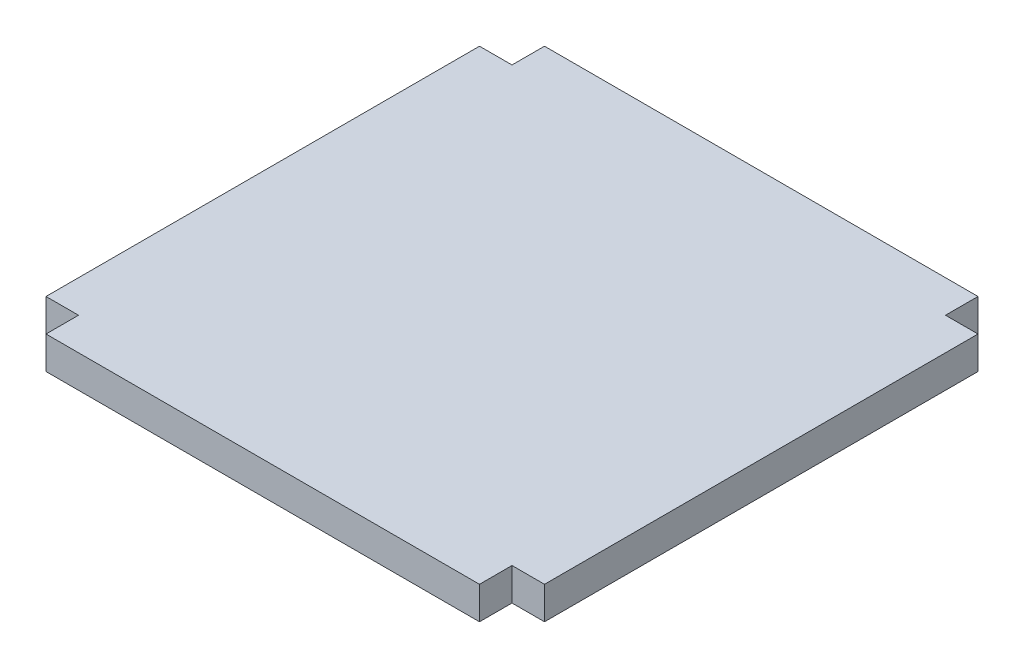
ISO-10303-21;
HEADER;
FILE_DESCRIPTION(('STEP AP214'),'2;1');
FILE_NAME('part.step','',(''),(''),'','','');
FILE_SCHEMA(('AUTOMOTIVE_DESIGN { 1 0 10303 214 1 1 1 1 }'));
ENDSEC;
DATA;
#1=APPLICATION_CONTEXT('core data for automotive mechanical design processes');
#2=APPLICATION_PROTOCOL_DEFINITION('international standard','automotive_design',2000,#1);
#3=PRODUCT_CONTEXT('',#1,'mechanical');
#4=PRODUCT('Part','Part','',(#3));
#5=PRODUCT_RELATED_PRODUCT_CATEGORY('part','',(#4));
#6=PRODUCT_DEFINITION_FORMATION('','',#4);
#7=PRODUCT_DEFINITION_CONTEXT('part definition',#1,'design');
#8=PRODUCT_DEFINITION('design','',#6,#7);
#9=PRODUCT_DEFINITION_SHAPE('','',#8);
#10=(LENGTH_UNIT() NAMED_UNIT(*) SI_UNIT(.MILLI.,.METRE.));
#11=(NAMED_UNIT(*) PLANE_ANGLE_UNIT() SI_UNIT($,.RADIAN.));
#12=(NAMED_UNIT(*) SI_UNIT($,.STERADIAN.) SOLID_ANGLE_UNIT());
#13=UNCERTAINTY_MEASURE_WITH_UNIT(LENGTH_MEASURE(1.E-05),#10,'distance_accuracy_value','');
#14=(GEOMETRIC_REPRESENTATION_CONTEXT(3) GLOBAL_UNCERTAINTY_ASSIGNED_CONTEXT((#13)) GLOBAL_UNIT_ASSIGNED_CONTEXT((#10,
#11,#12)) REPRESENTATION_CONTEXT('',''));
#15=CARTESIAN_POINT('',(0.,0.,0.));
#16=DIRECTION('',(0.,0.,1.));
#17=DIRECTION('',(1.,0.,0.));
#18=AXIS2_PLACEMENT_3D('',#15,#16,#17);
#19=CARTESIAN_POINT('',(-115.,15.,-100.));
#20=DIRECTION('',(1.,0.,0.));
#21=DIRECTION('',(0.,0.,-1.));
#22=AXIS2_PLACEMENT_3D('',#19,#20,#21);
#23=PLANE('',#22);
#24=DIRECTION('',(0.,0.,1.));
#25=VECTOR('',#24,1.);
#26=CARTESIAN_POINT('',(-115.,0.,-100.));
#27=LINE('',#26,#25);
#28=CARTESIAN_POINT('',(-115.,0.,-100.));
#29=VERTEX_POINT('',#28);
#30=CARTESIAN_POINT('',(-115.,0.,100.));
#31=VERTEX_POINT('',#30);
#32=EDGE_CURVE('E155',#29,#31,#27,.T.);
#33=ORIENTED_EDGE('',*,*,#32,.T.);
#34=DIRECTION('',(0.,-1.,0.));
#35=VECTOR('',#34,1.);
#36=CARTESIAN_POINT('',(-115.,15.,100.));
#37=LINE('',#36,#35);
#38=CARTESIAN_POINT('',(-115.,15.,100.));
#39=VERTEX_POINT('',#38);
#40=EDGE_CURVE('E11',#39,#31,#37,.T.);
#41=ORIENTED_EDGE('',*,*,#40,.F.);
#42=DIRECTION('',(0.,0.,1.));
#43=VECTOR('',#42,1.);
#44=CARTESIAN_POINT('',(-115.,15.,-100.));
#45=LINE('',#44,#43);
#46=CARTESIAN_POINT('',(-115.,15.,-100.));
#47=VERTEX_POINT('',#46);
#48=EDGE_CURVE('E177',#47,#39,#45,.T.);
#49=ORIENTED_EDGE('',*,*,#48,.F.);
#50=DIRECTION('',(0.,-1.,0.));
#51=VECTOR('',#50,1.);
#52=CARTESIAN_POINT('',(-115.,15.,-100.));
#53=LINE('',#52,#51);
#54=EDGE_CURVE('E151',#47,#29,#53,.T.);
#55=ORIENTED_EDGE('',*,*,#54,.T.);
#56=EDGE_LOOP('',(#33,#41,#49,#55));
#57=FACE_BOUND('',#56,.T.);
#58=ADVANCED_FACE('F35',(#57),#23,.F.);
#59=CARTESIAN_POINT('',(-99.9999999999999,15.,100.));
#60=DIRECTION('',(0.,0.,-1.));
#61=DIRECTION('',(-1.,0.,0.));
#62=AXIS2_PLACEMENT_3D('',#59,#60,#61);
#63=PLANE('',#62);
#64=DIRECTION('',(1.,0.,0.));
#65=VECTOR('',#64,1.);
#66=CARTESIAN_POINT('',(-99.9999999999999,0.,100.));
#67=LINE('',#66,#65);
#68=CARTESIAN_POINT('',(-99.9999999999999,0.,100.));
#69=VERTEX_POINT('',#68);
#70=EDGE_CURVE('E158',#31,#69,#67,.T.);
#71=ORIENTED_EDGE('',*,*,#70,.T.);
#72=DIRECTION('',(0.,-1.,0.));
#73=VECTOR('',#72,1.);
#74=CARTESIAN_POINT('',(-99.9999999999999,15.,100.));
#75=LINE('',#74,#73);
#76=CARTESIAN_POINT('',(-99.9999999999999,15.,100.));
#77=VERTEX_POINT('',#76);
#78=EDGE_CURVE('E43',#77,#69,#75,.T.);
#79=ORIENTED_EDGE('',*,*,#78,.F.);
#80=DIRECTION('',(1.,0.,0.));
#81=VECTOR('',#80,1.);
#82=CARTESIAN_POINT('',(-99.9999999999999,15.,100.));
#83=LINE('',#82,#81);
#84=EDGE_CURVE('E106',#39,#77,#83,.T.);
#85=ORIENTED_EDGE('',*,*,#84,.F.);
#86=ORIENTED_EDGE('',*,*,#40,.T.);
#87=EDGE_LOOP('',(#71,#79,#85,#86));
#88=FACE_BOUND('',#87,.T.);
#89=ADVANCED_FACE('F255',(#88),#63,.F.);
#90=CARTESIAN_POINT('',(-100.,15.,115.));
#91=DIRECTION('',(1.,0.,0.));
#92=DIRECTION('',(0.,0.,-1.));
#93=AXIS2_PLACEMENT_3D('',#90,#91,#92);
#94=PLANE('',#93);
#95=DIRECTION('',(0.,0.,1.));
#96=VECTOR('',#95,1.);
#97=CARTESIAN_POINT('',(-100.,0.,115.));
#98=LINE('',#97,#96);
#99=CARTESIAN_POINT('',(-100.,0.,115.));
#100=VERTEX_POINT('',#99);
#101=EDGE_CURVE('E160',#69,#100,#98,.T.);
#102=ORIENTED_EDGE('',*,*,#101,.T.);
#103=DIRECTION('',(0.,-1.,0.));
#104=VECTOR('',#103,1.);
#105=CARTESIAN_POINT('',(-100.,15.,115.));
#106=LINE('',#105,#104);
#107=CARTESIAN_POINT('',(-100.,15.,115.));
#108=VERTEX_POINT('',#107);
#109=EDGE_CURVE('E196',#108,#100,#106,.T.);
#110=ORIENTED_EDGE('',*,*,#109,.F.);
#111=DIRECTION('',(0.,0.,1.));
#112=VECTOR('',#111,1.);
#113=CARTESIAN_POINT('',(-100.,15.,115.));
#114=LINE('',#113,#112);
#115=EDGE_CURVE('E204',#77,#108,#114,.T.);
#116=ORIENTED_EDGE('',*,*,#115,.F.);
#117=ORIENTED_EDGE('',*,*,#78,.T.);
#118=EDGE_LOOP('',(#102,#110,#116,#117));
#119=FACE_BOUND('',#118,.T.);
#120=ADVANCED_FACE('F202',(#119),#94,.F.);
#121=CARTESIAN_POINT('',(-100.,15.,115.));
#122=DIRECTION('',(0.,0.,-1.));
#123=DIRECTION('',(-1.,0.,0.));
#124=AXIS2_PLACEMENT_3D('',#121,#122,#123);
#125=PLANE('',#124);
#126=DIRECTION('',(1.,0.,0.));
#127=VECTOR('',#126,1.);
#128=CARTESIAN_POINT('',(-100.,0.,115.));
#129=LINE('',#128,#127);
#130=CARTESIAN_POINT('',(100.,0.,115.));
#131=VERTEX_POINT('',#130);
#132=EDGE_CURVE('E162',#100,#131,#129,.T.);
#133=ORIENTED_EDGE('',*,*,#132,.T.);
#134=DIRECTION('',(0.,-1.,0.));
#135=VECTOR('',#134,1.);
#136=CARTESIAN_POINT('',(100.,15.,115.));
#137=LINE('',#136,#135);
#138=CARTESIAN_POINT('',(100.,15.,115.));
#139=VERTEX_POINT('',#138);
#140=EDGE_CURVE('E193',#139,#131,#137,.T.);
#141=ORIENTED_EDGE('',*,*,#140,.F.);
#142=DIRECTION('',(1.,0.,0.));
#143=VECTOR('',#142,1.);
#144=CARTESIAN_POINT('',(-100.,15.,115.));
#145=LINE('',#144,#143);
#146=EDGE_CURVE('E222',#108,#139,#145,.T.);
#147=ORIENTED_EDGE('',*,*,#146,.F.);
#148=ORIENTED_EDGE('',*,*,#109,.T.);
#149=EDGE_LOOP('',(#133,#141,#147,#148));
#150=FACE_BOUND('',#149,.T.);
#151=ADVANCED_FACE('F213',(#150),#125,.F.);
#152=CARTESIAN_POINT('',(100.,15.,115.));
#153=DIRECTION('',(-1.,0.,0.));
#154=DIRECTION('',(0.,0.,1.));
#155=AXIS2_PLACEMENT_3D('',#152,#153,#154);
#156=PLANE('',#155);
#157=DIRECTION('',(0.,0.,-1.));
#158=VECTOR('',#157,1.);
#159=CARTESIAN_POINT('',(100.,0.,115.));
#160=LINE('',#159,#158);
#161=CARTESIAN_POINT('',(100.,0.,100.));
#162=VERTEX_POINT('',#161);
#163=EDGE_CURVE('E164',#131,#162,#160,.T.);
#164=ORIENTED_EDGE('',*,*,#163,.T.);
#165=DIRECTION('',(0.,-1.,0.));
#166=VECTOR('',#165,1.);
#167=CARTESIAN_POINT('',(100.,15.,100.));
#168=LINE('',#167,#166);
#169=CARTESIAN_POINT('',(100.,15.,100.));
#170=VERTEX_POINT('',#169);
#171=EDGE_CURVE('E190',#170,#162,#168,.T.);
#172=ORIENTED_EDGE('',*,*,#171,.F.);
#173=DIRECTION('',(0.,0.,-1.));
#174=VECTOR('',#173,1.);
#175=CARTESIAN_POINT('',(100.,15.,115.));
#176=LINE('',#175,#174);
#177=EDGE_CURVE('E219',#139,#170,#176,.T.);
#178=ORIENTED_EDGE('',*,*,#177,.F.);
#179=ORIENTED_EDGE('',*,*,#140,.T.);
#180=EDGE_LOOP('',(#164,#172,#178,#179));
#181=FACE_BOUND('',#180,.T.);
#182=ADVANCED_FACE('F217',(#181),#156,.F.);
#183=CARTESIAN_POINT('',(100.,15.,100.));
#184=DIRECTION('',(0.,0.,-1.));
#185=DIRECTION('',(-1.,0.,0.));
#186=AXIS2_PLACEMENT_3D('',#183,#184,#185);
#187=PLANE('',#186);
#188=DIRECTION('',(1.,0.,0.));
#189=VECTOR('',#188,1.);
#190=CARTESIAN_POINT('',(100.,0.,100.));
#191=LINE('',#190,#189);
#192=CARTESIAN_POINT('',(115.,0.,100.));
#193=VERTEX_POINT('',#192);
#194=EDGE_CURVE('E166',#162,#193,#191,.T.);
#195=ORIENTED_EDGE('',*,*,#194,.T.);
#196=DIRECTION('',(0.,-1.,0.));
#197=VECTOR('',#196,1.);
#198=CARTESIAN_POINT('',(115.,15.,100.));
#199=LINE('',#198,#197);
#200=CARTESIAN_POINT('',(115.,15.,100.));
#201=VERTEX_POINT('',#200);
#202=EDGE_CURVE('E187',#201,#193,#199,.T.);
#203=ORIENTED_EDGE('',*,*,#202,.F.);
#204=DIRECTION('',(1.,0.,0.));
#205=VECTOR('',#204,1.);
#206=CARTESIAN_POINT('',(100.,15.,100.));
#207=LINE('',#206,#205);
#208=EDGE_CURVE('E221',#170,#201,#207,.T.);
#209=ORIENTED_EDGE('',*,*,#208,.F.);
#210=ORIENTED_EDGE('',*,*,#171,.T.);
#211=EDGE_LOOP('',(#195,#203,#209,#210));
#212=FACE_BOUND('',#211,.T.);
#213=ADVANCED_FACE('F268',(#212),#187,.F.);
#214=CARTESIAN_POINT('',(115.,15.,-100.));
#215=DIRECTION('',(-1.,0.,0.));
#216=DIRECTION('',(0.,0.,1.));
#217=AXIS2_PLACEMENT_3D('',#214,#215,#216);
#218=PLANE('',#217);
#219=DIRECTION('',(0.,0.,-1.));
#220=VECTOR('',#219,1.);
#221=CARTESIAN_POINT('',(115.,0.,-100.));
#222=LINE('',#221,#220);
#223=CARTESIAN_POINT('',(115.,0.,-100.));
#224=VERTEX_POINT('',#223);
#225=EDGE_CURVE('E168',#193,#224,#222,.T.);
#226=ORIENTED_EDGE('',*,*,#225,.T.);
#227=DIRECTION('',(0.,-1.,0.));
#228=VECTOR('',#227,1.);
#229=CARTESIAN_POINT('',(115.,15.,-100.));
#230=LINE('',#229,#228);
#231=CARTESIAN_POINT('',(115.,15.,-100.));
#232=VERTEX_POINT('',#231);
#233=EDGE_CURVE('E184',#232,#224,#230,.T.);
#234=ORIENTED_EDGE('',*,*,#233,.F.);
#235=DIRECTION('',(0.,0.,-1.));
#236=VECTOR('',#235,1.);
#237=CARTESIAN_POINT('',(115.,15.,-100.));
#238=LINE('',#237,#236);
#239=EDGE_CURVE('E224',#201,#232,#238,.T.);
#240=ORIENTED_EDGE('',*,*,#239,.F.);
#241=ORIENTED_EDGE('',*,*,#202,.T.);
#242=EDGE_LOOP('',(#226,#234,#240,#241));
#243=FACE_BOUND('',#242,.T.);
#244=ADVANCED_FACE('F271',(#243),#218,.F.);
#245=CARTESIAN_POINT('',(115.,15.,-100.));
#246=DIRECTION('',(0.,0.,1.));
#247=DIRECTION('',(1.,0.,0.));
#248=AXIS2_PLACEMENT_3D('',#245,#246,#247);
#249=PLANE('',#248);
#250=DIRECTION('',(-1.,0.,0.));
#251=VECTOR('',#250,1.);
#252=CARTESIAN_POINT('',(115.,0.,-100.));
#253=LINE('',#252,#251);
#254=CARTESIAN_POINT('',(100.,0.,-100.));
#255=VERTEX_POINT('',#254);
#256=EDGE_CURVE('E170',#224,#255,#253,.T.);
#257=ORIENTED_EDGE('',*,*,#256,.T.);
#258=DIRECTION('',(0.,-1.,0.));
#259=VECTOR('',#258,1.);
#260=CARTESIAN_POINT('',(100.,15.,-100.));
#261=LINE('',#260,#259);
#262=CARTESIAN_POINT('',(100.,15.,-100.));
#263=VERTEX_POINT('',#262);
#264=EDGE_CURVE('E181',#263,#255,#261,.T.);
#265=ORIENTED_EDGE('',*,*,#264,.F.);
#266=DIRECTION('',(-1.,0.,0.));
#267=VECTOR('',#266,1.);
#268=CARTESIAN_POINT('',(115.,15.,-100.));
#269=LINE('',#268,#267);
#270=EDGE_CURVE('E230',#232,#263,#269,.T.);
#271=ORIENTED_EDGE('',*,*,#270,.F.);
#272=ORIENTED_EDGE('',*,*,#233,.T.);
#273=EDGE_LOOP('',(#257,#265,#271,#272));
#274=FACE_BOUND('',#273,.T.);
#275=ADVANCED_FACE('F236',(#274),#249,.F.);
#276=CARTESIAN_POINT('',(100.,15.,-100.));
#277=DIRECTION('',(-1.,0.,0.));
#278=DIRECTION('',(0.,0.,1.));
#279=AXIS2_PLACEMENT_3D('',#276,#277,#278);
#280=PLANE('',#279);
#281=DIRECTION('',(0.,0.,-1.));
#282=VECTOR('',#281,1.);
#283=CARTESIAN_POINT('',(100.,0.,-100.));
#284=LINE('',#283,#282);
#285=CARTESIAN_POINT('',(100.,0.,-115.));
#286=VERTEX_POINT('',#285);
#287=EDGE_CURVE('E172',#255,#286,#284,.T.);
#288=ORIENTED_EDGE('',*,*,#287,.T.);
#289=DIRECTION('',(0.,-1.,0.));
#290=VECTOR('',#289,1.);
#291=CARTESIAN_POINT('',(100.,15.,-115.));
#292=LINE('',#291,#290);
#293=CARTESIAN_POINT('',(100.,15.,-115.));
#294=VERTEX_POINT('',#293);
#295=EDGE_CURVE('E146',#294,#286,#292,.T.);
#296=ORIENTED_EDGE('',*,*,#295,.F.);
#297=DIRECTION('',(0.,0.,-1.));
#298=VECTOR('',#297,1.);
#299=CARTESIAN_POINT('',(100.,15.,-100.));
#300=LINE('',#299,#298);
#301=EDGE_CURVE('E137',#263,#294,#300,.T.);
#302=ORIENTED_EDGE('',*,*,#301,.F.);
#303=ORIENTED_EDGE('',*,*,#264,.T.);
#304=EDGE_LOOP('',(#288,#296,#302,#303));
#305=FACE_BOUND('',#304,.T.);
#306=ADVANCED_FACE('F240',(#305),#280,.F.);
#307=CARTESIAN_POINT('',(-100.,15.,-115.));
#308=DIRECTION('',(0.,0.,1.));
#309=DIRECTION('',(1.,0.,0.));
#310=AXIS2_PLACEMENT_3D('',#307,#308,#309);
#311=PLANE('',#310);
#312=DIRECTION('',(-1.,0.,0.));
#313=VECTOR('',#312,1.);
#314=CARTESIAN_POINT('',(-100.,0.,-115.));
#315=LINE('',#314,#313);
#316=CARTESIAN_POINT('',(-100.,0.,-115.));
#317=VERTEX_POINT('',#316);
#318=EDGE_CURVE('E145',#286,#317,#315,.T.);
#319=ORIENTED_EDGE('',*,*,#318,.T.);
#320=DIRECTION('',(0.,-1.,0.));
#321=VECTOR('',#320,1.);
#322=CARTESIAN_POINT('',(-100.,15.,-115.));
#323=LINE('',#322,#321);
#324=CARTESIAN_POINT('',(-100.,15.,-115.));
#325=VERTEX_POINT('',#324);
#326=EDGE_CURVE('E142',#325,#317,#323,.T.);
#327=ORIENTED_EDGE('',*,*,#326,.F.);
#328=DIRECTION('',(-1.,0.,0.));
#329=VECTOR('',#328,1.);
#330=CARTESIAN_POINT('',(-100.,15.,-115.));
#331=LINE('',#330,#329);
#332=EDGE_CURVE('E131',#294,#325,#331,.T.);
#333=ORIENTED_EDGE('',*,*,#332,.F.);
#334=ORIENTED_EDGE('',*,*,#295,.T.);
#335=EDGE_LOOP('',(#319,#327,#333,#334));
#336=FACE_BOUND('',#335,.T.);
#337=ADVANCED_FACE('F143',(#336),#311,.F.);
#338=CARTESIAN_POINT('',(-100.,15.,-100.));
#339=DIRECTION('',(1.,0.,0.));
#340=DIRECTION('',(0.,0.,-1.));
#341=AXIS2_PLACEMENT_3D('',#338,#339,#340);
#342=PLANE('',#341);
#343=DIRECTION('',(0.,0.,1.));
#344=VECTOR('',#343,1.);
#345=CARTESIAN_POINT('',(-100.,0.,-100.));
#346=LINE('',#345,#344);
#347=CARTESIAN_POINT('',(-100.,0.,-100.));
#348=VERTEX_POINT('',#347);
#349=EDGE_CURVE('E92',#317,#348,#346,.T.);
#350=ORIENTED_EDGE('',*,*,#349,.T.);
#351=DIRECTION('',(0.,-1.,0.));
#352=VECTOR('',#351,1.);
#353=CARTESIAN_POINT('',(-100.,15.,-100.));
#354=LINE('',#353,#352);
#355=CARTESIAN_POINT('',(-100.,15.,-100.));
#356=VERTEX_POINT('',#355);
#357=EDGE_CURVE('E147',#356,#348,#354,.T.);
#358=ORIENTED_EDGE('',*,*,#357,.F.);
#359=DIRECTION('',(0.,0.,1.));
#360=VECTOR('',#359,1.);
#361=CARTESIAN_POINT('',(-100.,15.,-100.));
#362=LINE('',#361,#360);
#363=EDGE_CURVE('E135',#325,#356,#362,.T.);
#364=ORIENTED_EDGE('',*,*,#363,.F.);
#365=ORIENTED_EDGE('',*,*,#326,.T.);
#366=EDGE_LOOP('',(#350,#358,#364,#365));
#367=FACE_BOUND('',#366,.T.);
#368=ADVANCED_FACE('F149',(#367),#342,.F.);
#369=CARTESIAN_POINT('',(-115.,15.,-100.));
#370=DIRECTION('',(0.,0.,1.));
#371=DIRECTION('',(1.,0.,0.));
#372=AXIS2_PLACEMENT_3D('',#369,#370,#371);
#373=PLANE('',#372);
#374=DIRECTION('',(-1.,0.,0.));
#375=VECTOR('',#374,1.);
#376=CARTESIAN_POINT('',(-115.,0.,-100.));
#377=LINE('',#376,#375);
#378=EDGE_CURVE('E98',#348,#29,#377,.T.);
#379=ORIENTED_EDGE('',*,*,#378,.T.);
#380=ORIENTED_EDGE('',*,*,#54,.F.);
#381=DIRECTION('',(-1.,0.,0.));
#382=VECTOR('',#381,1.);
#383=CARTESIAN_POINT('',(-115.,15.,-100.));
#384=LINE('',#383,#382);
#385=EDGE_CURVE('E51',#356,#47,#384,.T.);
#386=ORIENTED_EDGE('',*,*,#385,.F.);
#387=ORIENTED_EDGE('',*,*,#357,.T.);
#388=EDGE_LOOP('',(#379,#380,#386,#387));
#389=FACE_BOUND('',#388,.T.);
#390=ADVANCED_FACE('F244',(#389),#373,.F.);
#391=CARTESIAN_POINT('',(0.,15.,0.));
#392=DIRECTION('',(0.,-1.,0.));
#393=DIRECTION('',(0.,0.,-1.));
#394=AXIS2_PLACEMENT_3D('',#391,#392,#393);
#395=PLANE('',#394);
#396=ORIENTED_EDGE('',*,*,#48,.T.);
#397=ORIENTED_EDGE('',*,*,#84,.T.);
#398=ORIENTED_EDGE('',*,*,#115,.T.);
#399=ORIENTED_EDGE('',*,*,#146,.T.);
#400=ORIENTED_EDGE('',*,*,#177,.T.);
#401=ORIENTED_EDGE('',*,*,#208,.T.);
#402=ORIENTED_EDGE('',*,*,#239,.T.);
#403=ORIENTED_EDGE('',*,*,#270,.T.);
#404=ORIENTED_EDGE('',*,*,#301,.T.);
#405=ORIENTED_EDGE('',*,*,#332,.T.);
#406=ORIENTED_EDGE('',*,*,#363,.T.);
#407=ORIENTED_EDGE('',*,*,#385,.T.);
#408=EDGE_LOOP('',(#396,#397,#398,#399,#400,#401,#402,#403,#404,#405,#406,#407));
#409=FACE_BOUND('',#408,.T.);
#410=ADVANCED_FACE('F133',(#409),#395,.F.);
#411=CARTESIAN_POINT('',(0.,0.,0.));
#412=DIRECTION('',(0.,-1.,0.));
#413=DIRECTION('',(0.,0.,-1.));
#414=AXIS2_PLACEMENT_3D('',#411,#412,#413);
#415=PLANE('',#414);
#416=ORIENTED_EDGE('',*,*,#32,.F.);
#417=ORIENTED_EDGE('',*,*,#378,.F.);
#418=ORIENTED_EDGE('',*,*,#349,.F.);
#419=ORIENTED_EDGE('',*,*,#318,.F.);
#420=ORIENTED_EDGE('',*,*,#287,.F.);
#421=ORIENTED_EDGE('',*,*,#256,.F.);
#422=ORIENTED_EDGE('',*,*,#225,.F.);
#423=ORIENTED_EDGE('',*,*,#194,.F.);
#424=ORIENTED_EDGE('',*,*,#163,.F.);
#425=ORIENTED_EDGE('',*,*,#132,.F.);
#426=ORIENTED_EDGE('',*,*,#101,.F.);
#427=ORIENTED_EDGE('',*,*,#70,.F.);
#428=EDGE_LOOP('',(#416,#417,#418,#419,#420,#421,#422,#423,#424,#425,#426,#427));
#429=FACE_BOUND('',#428,.T.);
#430=ADVANCED_FACE('F208',(#429),#415,.T.);
#431=CLOSED_SHELL('',(#58,#89,#120,#151,#182,#213,#244,#275,#306,#337,#368,#390,#410,#430));
#432=MANIFOLD_SOLID_BREP('B2',#431);
#433=ADVANCED_BREP_SHAPE_REPRESENTATION('',(#18,#432),#14);
#434=SHAPE_DEFINITION_REPRESENTATION(#9,#433);
ENDSEC;
END-ISO-10303-21;
